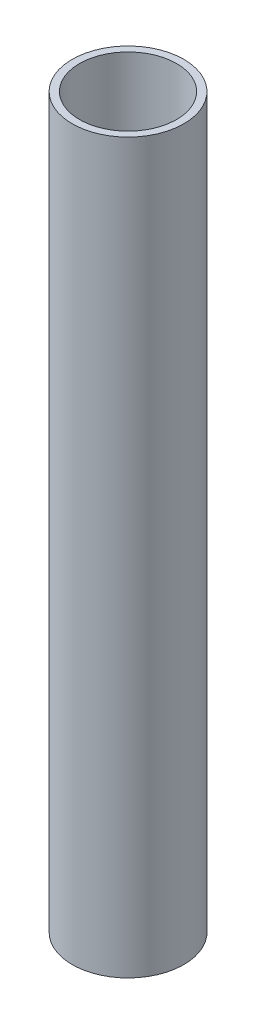
ISO-10303-21;
HEADER;
FILE_DESCRIPTION(('STEP AP214'),'2;1');
FILE_NAME('part.step','',(''),(''),'','','');
FILE_SCHEMA(('AUTOMOTIVE_DESIGN { 1 0 10303 214 1 1 1 1 }'));
ENDSEC;
DATA;
#1=APPLICATION_CONTEXT('core data for automotive mechanical design processes');
#2=APPLICATION_PROTOCOL_DEFINITION('international standard','automotive_design',2000,#1);
#3=PRODUCT_CONTEXT('',#1,'mechanical');
#4=PRODUCT('Part','Part','',(#3));
#5=PRODUCT_RELATED_PRODUCT_CATEGORY('part','',(#4));
#6=PRODUCT_DEFINITION_FORMATION('','',#4);
#7=PRODUCT_DEFINITION_CONTEXT('part definition',#1,'design');
#8=PRODUCT_DEFINITION('design','',#6,#7);
#9=PRODUCT_DEFINITION_SHAPE('','',#8);
#10=(LENGTH_UNIT() NAMED_UNIT(*) SI_UNIT(.MILLI.,.METRE.));
#11=(NAMED_UNIT(*) PLANE_ANGLE_UNIT() SI_UNIT($,.RADIAN.));
#12=(NAMED_UNIT(*) SI_UNIT($,.STERADIAN.) SOLID_ANGLE_UNIT());
#13=UNCERTAINTY_MEASURE_WITH_UNIT(LENGTH_MEASURE(1.E-05),#10,'distance_accuracy_value','');
#14=(GEOMETRIC_REPRESENTATION_CONTEXT(3) GLOBAL_UNCERTAINTY_ASSIGNED_CONTEXT((#13)) GLOBAL_UNIT_ASSIGNED_CONTEXT((#10,
#11,#12)) REPRESENTATION_CONTEXT('',''));
#15=CARTESIAN_POINT('',(0.,0.,0.));
#16=DIRECTION('',(0.,0.,1.));
#17=DIRECTION('',(1.,0.,0.));
#18=AXIS2_PLACEMENT_3D('',#15,#16,#17);
#19=CARTESIAN_POINT('',(0.,0.,0.));
#20=DIRECTION('',(0.,-1.,0.));
#21=DIRECTION('',(0.,0.,-1.));
#22=AXIS2_PLACEMENT_3D('',#19,#20,#21);
#23=CYLINDRICAL_SURFACE('',#22,10.);
#24=CARTESIAN_POINT('',(0.,0.,0.));
#25=DIRECTION('',(0.,-1.,0.));
#26=DIRECTION('',(0.,0.,-1.));
#27=AXIS2_PLACEMENT_3D('',#24,#25,#26);
#28=CIRCLE('',#27,10.);
#29=CARTESIAN_POINT('',(0.,0.,-10.));
#30=VERTEX_POINT('',#29);
#31=EDGE_CURVE('E10',#30,#30,#28,.T.);
#32=ORIENTED_EDGE('',*,*,#31,.T.);
#33=EDGE_LOOP('',(#32));
#34=FACE_BOUND('',#33,.T.);
#35=CARTESIAN_POINT('',(0.,150.,0.));
#36=DIRECTION('',(0.,-1.,0.));
#37=DIRECTION('',(0.,0.,-1.));
#38=AXIS2_PLACEMENT_3D('',#35,#36,#37);
#39=CIRCLE('',#38,9.99999999999999);
#40=CARTESIAN_POINT('',(0.,150.,-9.99999999999999));
#41=VERTEX_POINT('',#40);
#42=EDGE_CURVE('E45',#41,#41,#39,.T.);
#43=ORIENTED_EDGE('',*,*,#42,.F.);
#44=EDGE_LOOP('',(#43));
#45=FACE_BOUND('',#44,.T.);
#46=ADVANCED_FACE('F31',(#34,#45),#23,.F.);
#47=CARTESIAN_POINT('',(10.,0.,0.));
#48=DIRECTION('',(0.,-1.,0.));
#49=DIRECTION('',(0.,0.,-1.));
#50=AXIS2_PLACEMENT_3D('',#47,#48,#49);
#51=PLANE('',#50);
#52=CARTESIAN_POINT('',(0.,0.,0.));
#53=DIRECTION('',(0.,-1.,0.));
#54=DIRECTION('',(0.,0.,-1.));
#55=AXIS2_PLACEMENT_3D('',#52,#53,#54);
#56=CIRCLE('',#55,11.5);
#57=CARTESIAN_POINT('',(0.,0.,-11.5));
#58=VERTEX_POINT('',#57);
#59=EDGE_CURVE('E37',#58,#58,#56,.T.);
#60=ORIENTED_EDGE('',*,*,#59,.T.);
#61=EDGE_LOOP('',(#60));
#62=FACE_BOUND('',#61,.T.);
#63=ORIENTED_EDGE('',*,*,#31,.F.);
#64=EDGE_LOOP('',(#63));
#65=FACE_BOUND('',#64,.T.);
#66=ADVANCED_FACE('F55',(#62,#65),#51,.T.);
#67=CARTESIAN_POINT('',(0.,0.,0.));
#68=DIRECTION('',(0.,-1.,0.));
#69=DIRECTION('',(0.,0.,-1.));
#70=AXIS2_PLACEMENT_3D('',#67,#68,#69);
#71=CYLINDRICAL_SURFACE('',#70,11.5);
#72=CARTESIAN_POINT('',(0.,150.,0.));
#73=DIRECTION('',(0.,-1.,0.));
#74=DIRECTION('',(0.,0.,-1.));
#75=AXIS2_PLACEMENT_3D('',#72,#73,#74);
#76=CIRCLE('',#75,11.5);
#77=CARTESIAN_POINT('',(0.,150.,-11.5));
#78=VERTEX_POINT('',#77);
#79=EDGE_CURVE('E41',#78,#78,#76,.T.);
#80=ORIENTED_EDGE('',*,*,#79,.T.);
#81=EDGE_LOOP('',(#80));
#82=FACE_BOUND('',#81,.T.);
#83=ORIENTED_EDGE('',*,*,#59,.F.);
#84=EDGE_LOOP('',(#83));
#85=FACE_BOUND('',#84,.T.);
#86=ADVANCED_FACE('F59',(#82,#85),#71,.T.);
#87=CARTESIAN_POINT('',(11.5,150.,0.));
#88=DIRECTION('',(0.,1.,0.));
#89=DIRECTION('',(0.,0.,1.));
#90=AXIS2_PLACEMENT_3D('',#87,#88,#89);
#91=PLANE('',#90);
#92=ORIENTED_EDGE('',*,*,#42,.T.);
#93=EDGE_LOOP('',(#92));
#94=FACE_BOUND('',#93,.T.);
#95=ORIENTED_EDGE('',*,*,#79,.F.);
#96=EDGE_LOOP('',(#95));
#97=FACE_BOUND('',#96,.T.);
#98=ADVANCED_FACE('F51',(#94,#97),#91,.T.);
#99=CLOSED_SHELL('',(#46,#66,#86,#98));
#100=MANIFOLD_SOLID_BREP('B2',#99);
#101=ADVANCED_BREP_SHAPE_REPRESENTATION('',(#18,#100),#14);
#102=SHAPE_DEFINITION_REPRESENTATION(#9,#101);
ENDSEC;
END-ISO-10303-21;
